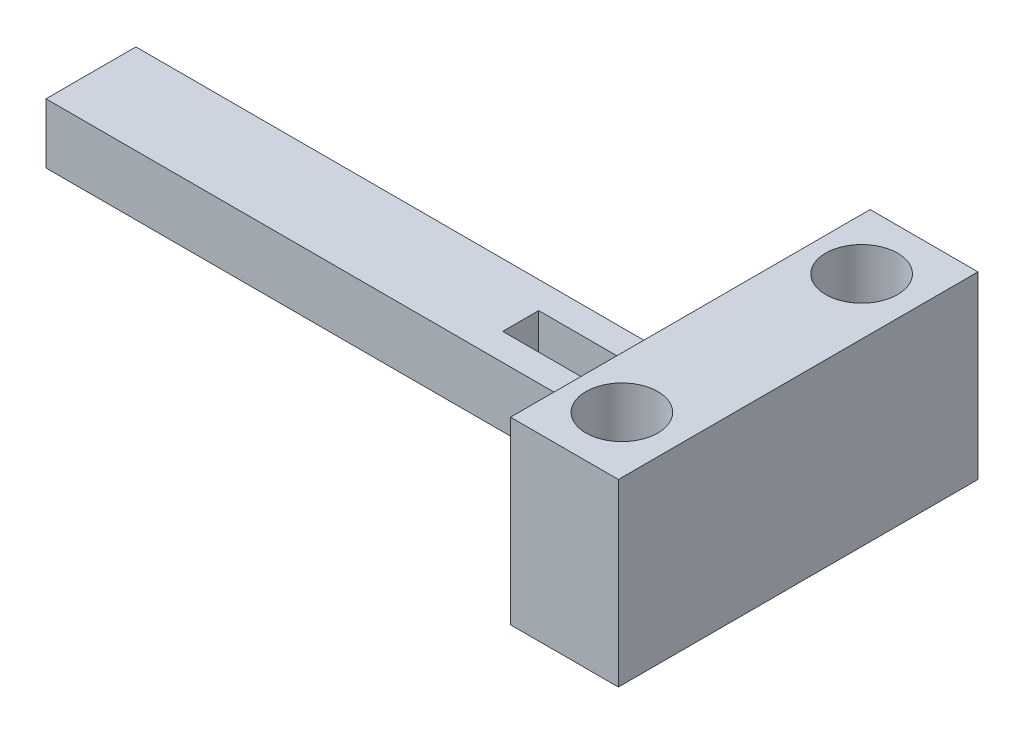
ISO-10303-21;
HEADER;
FILE_DESCRIPTION(('STEP AP214'),'2;1');
FILE_NAME('part.step','',(''),(''),'','','');
FILE_SCHEMA(('AUTOMOTIVE_DESIGN { 1 0 10303 214 1 1 1 1 }'));
ENDSEC;
DATA;
#1=APPLICATION_CONTEXT('core data for automotive mechanical design processes');
#2=APPLICATION_PROTOCOL_DEFINITION('international standard','automotive_design',2000,#1);
#3=PRODUCT_CONTEXT('',#1,'mechanical');
#4=PRODUCT('Part','Part','',(#3));
#5=PRODUCT_RELATED_PRODUCT_CATEGORY('part','',(#4));
#6=PRODUCT_DEFINITION_FORMATION('','',#4);
#7=PRODUCT_DEFINITION_CONTEXT('part definition',#1,'design');
#8=PRODUCT_DEFINITION('design','',#6,#7);
#9=PRODUCT_DEFINITION_SHAPE('','',#8);
#10=(LENGTH_UNIT() NAMED_UNIT(*) SI_UNIT(.MILLI.,.METRE.));
#11=(NAMED_UNIT(*) PLANE_ANGLE_UNIT() SI_UNIT($,.RADIAN.));
#12=(NAMED_UNIT(*) SI_UNIT($,.STERADIAN.) SOLID_ANGLE_UNIT());
#13=UNCERTAINTY_MEASURE_WITH_UNIT(LENGTH_MEASURE(1.E-05),#10,'distance_accuracy_value','');
#14=(GEOMETRIC_REPRESENTATION_CONTEXT(3) GLOBAL_UNCERTAINTY_ASSIGNED_CONTEXT((#13)) GLOBAL_UNIT_ASSIGNED_CONTEXT((#10,
#11,#12)) REPRESENTATION_CONTEXT('',''));
#15=CARTESIAN_POINT('',(0.,0.,0.));
#16=DIRECTION('',(0.,0.,1.));
#17=DIRECTION('',(1.,0.,0.));
#18=AXIS2_PLACEMENT_3D('',#15,#16,#17);
#19=CARTESIAN_POINT('',(0.,2.54,0.));
#20=DIRECTION('',(0.,1.,0.));
#21=DIRECTION('',(0.,0.,1.));
#22=AXIS2_PLACEMENT_3D('',#19,#20,#21);
#23=PLANE('',#22);
#24=DIRECTION('',(0.,0.,1.));
#25=VECTOR('',#24,1.);
#26=CARTESIAN_POINT('',(-12.7,2.54,1.905));
#27=LINE('',#26,#25);
#28=CARTESIAN_POINT('',(-12.7,2.54,-1.905));
#29=VERTEX_POINT('',#28);
#30=CARTESIAN_POINT('',(-12.7,2.54,1.905));
#31=VERTEX_POINT('',#30);
#32=EDGE_CURVE('E186',#29,#31,#27,.T.);
#33=ORIENTED_EDGE('',*,*,#32,.T.);
#34=DIRECTION('',(1.,0.,0.));
#35=VECTOR('',#34,1.);
#36=CARTESIAN_POINT('',(12.7,2.54,1.905));
#37=LINE('',#36,#35);
#38=CARTESIAN_POINT('',(12.7,2.54,1.905));
#39=VERTEX_POINT('',#38);
#40=EDGE_CURVE('E188',#31,#39,#37,.T.);
#41=ORIENTED_EDGE('',*,*,#40,.T.);
#42=DIRECTION('',(0.,0.,-1.));
#43=VECTOR('',#42,1.);
#44=CARTESIAN_POINT('',(12.7,2.54,1.905));
#45=LINE('',#44,#43);
#46=CARTESIAN_POINT('',(12.7,2.54,-1.905));
#47=VERTEX_POINT('',#46);
#48=EDGE_CURVE('E195',#39,#47,#45,.T.);
#49=ORIENTED_EDGE('',*,*,#48,.T.);
#50=DIRECTION('',(-1.,0.,0.));
#51=VECTOR('',#50,1.);
#52=CARTESIAN_POINT('',(12.7,2.54,-1.905));
#53=LINE('',#52,#51);
#54=EDGE_CURVE('E193',#47,#29,#53,.T.);
#55=ORIENTED_EDGE('',*,*,#54,.T.);
#56=EDGE_LOOP('',(#33,#41,#49,#55));
#57=FACE_BOUND('',#56,.T.);
#58=DIRECTION('',(-1.,0.,0.));
#59=VECTOR('',#58,1.);
#60=CARTESIAN_POINT('',(5.51234042553191,2.54,-0.762));
#61=LINE('',#60,#59);
#62=CARTESIAN_POINT('',(10.5923404255319,2.54,-0.762));
#63=VERTEX_POINT('',#62);
#64=CARTESIAN_POINT('',(5.51234042553191,2.54,-0.762));
#65=VERTEX_POINT('',#64);
#66=EDGE_CURVE('E163',#63,#65,#61,.T.);
#67=ORIENTED_EDGE('',*,*,#66,.F.);
#68=DIRECTION('',(0.,0.,-1.));
#69=VECTOR('',#68,1.);
#70=CARTESIAN_POINT('',(10.5923404255319,2.54,-0.762));
#71=LINE('',#70,#69);
#72=CARTESIAN_POINT('',(10.5923404255319,2.54,0.762));
#73=VERTEX_POINT('',#72);
#74=EDGE_CURVE('E165',#73,#63,#71,.T.);
#75=ORIENTED_EDGE('',*,*,#74,.F.);
#76=DIRECTION('',(1.,0.,0.));
#77=VECTOR('',#76,1.);
#78=CARTESIAN_POINT('',(5.51234042553191,2.54,0.762));
#79=LINE('',#78,#77);
#80=CARTESIAN_POINT('',(5.51234042553191,2.54,0.762));
#81=VERTEX_POINT('',#80);
#82=EDGE_CURVE('E166',#81,#73,#79,.T.);
#83=ORIENTED_EDGE('',*,*,#82,.F.);
#84=DIRECTION('',(0.,0.,1.));
#85=VECTOR('',#84,1.);
#86=CARTESIAN_POINT('',(5.51234042553191,2.54,-0.762));
#87=LINE('',#86,#85);
#88=EDGE_CURVE('E170',#65,#81,#87,.T.);
#89=ORIENTED_EDGE('',*,*,#88,.F.);
#90=EDGE_LOOP('',(#67,#75,#83,#89));
#91=FACE_BOUND('',#90,.T.);
#92=ADVANCED_FACE('F39',(#57,#91),#23,.T.);
#93=CARTESIAN_POINT('',(0.,0.,0.));
#94=DIRECTION('',(0.,1.,0.));
#95=DIRECTION('',(0.,0.,1.));
#96=AXIS2_PLACEMENT_3D('',#93,#94,#95);
#97=PLANE('',#96);
#98=DIRECTION('',(0.,0.,1.));
#99=VECTOR('',#98,1.);
#100=CARTESIAN_POINT('',(-12.7,0.,1.905));
#101=LINE('',#100,#99);
#102=CARTESIAN_POINT('',(-12.7,0.,-1.905));
#103=VERTEX_POINT('',#102);
#104=CARTESIAN_POINT('',(-12.7,0.,1.905));
#105=VERTEX_POINT('',#104);
#106=EDGE_CURVE('E183',#103,#105,#101,.T.);
#107=ORIENTED_EDGE('',*,*,#106,.F.);
#108=DIRECTION('',(-1.,0.,0.));
#109=VECTOR('',#108,1.);
#110=CARTESIAN_POINT('',(12.7,0.,-1.905));
#111=LINE('',#110,#109);
#112=CARTESIAN_POINT('',(12.7,0.,-1.905));
#113=VERTEX_POINT('',#112);
#114=EDGE_CURVE('E190',#113,#103,#111,.T.);
#115=ORIENTED_EDGE('',*,*,#114,.F.);
#116=DIRECTION('',(0.,0.,-1.));
#117=VECTOR('',#116,1.);
#118=CARTESIAN_POINT('',(12.7,0.,1.905));
#119=LINE('',#118,#117);
#120=CARTESIAN_POINT('',(12.7,0.,1.905));
#121=VERTEX_POINT('',#120);
#122=EDGE_CURVE('E205',#121,#113,#119,.T.);
#123=ORIENTED_EDGE('',*,*,#122,.F.);
#124=DIRECTION('',(1.,0.,0.));
#125=VECTOR('',#124,1.);
#126=CARTESIAN_POINT('',(12.7,0.,1.905));
#127=LINE('',#126,#125);
#128=EDGE_CURVE('E200',#105,#121,#127,.T.);
#129=ORIENTED_EDGE('',*,*,#128,.F.);
#130=EDGE_LOOP('',(#107,#115,#123,#129));
#131=FACE_BOUND('',#130,.T.);
#132=DIRECTION('',(0.,0.,-1.));
#133=VECTOR('',#132,1.);
#134=CARTESIAN_POINT('',(10.5923404255319,0.,-0.762));
#135=LINE('',#134,#133);
#136=CARTESIAN_POINT('',(10.5923404255319,0.,0.762));
#137=VERTEX_POINT('',#136);
#138=CARTESIAN_POINT('',(10.5923404255319,0.,-0.762));
#139=VERTEX_POINT('',#138);
#140=EDGE_CURVE('E62',#137,#139,#135,.T.);
#141=ORIENTED_EDGE('',*,*,#140,.T.);
#142=DIRECTION('',(-1.,0.,0.));
#143=VECTOR('',#142,1.);
#144=CARTESIAN_POINT('',(5.51234042553191,0.,-0.762));
#145=LINE('',#144,#143);
#146=CARTESIAN_POINT('',(5.51234042553191,0.,-0.762));
#147=VERTEX_POINT('',#146);
#148=EDGE_CURVE('E156',#139,#147,#145,.T.);
#149=ORIENTED_EDGE('',*,*,#148,.T.);
#150=DIRECTION('',(0.,0.,1.));
#151=VECTOR('',#150,1.);
#152=CARTESIAN_POINT('',(5.51234042553191,0.,-0.762));
#153=LINE('',#152,#151);
#154=CARTESIAN_POINT('',(5.51234042553191,0.,0.762));
#155=VERTEX_POINT('',#154);
#156=EDGE_CURVE('E173',#147,#155,#153,.T.);
#157=ORIENTED_EDGE('',*,*,#156,.T.);
#158=DIRECTION('',(1.,0.,0.));
#159=VECTOR('',#158,1.);
#160=CARTESIAN_POINT('',(5.51234042553191,0.,0.762));
#161=LINE('',#160,#159);
#162=EDGE_CURVE('E164',#155,#137,#161,.T.);
#163=ORIENTED_EDGE('',*,*,#162,.T.);
#164=EDGE_LOOP('',(#141,#149,#157,#163));
#165=FACE_BOUND('',#164,.T.);
#166=ADVANCED_FACE('F219',(#131,#165),#97,.F.);
#167=CARTESIAN_POINT('',(-12.7,2.54,1.905));
#168=DIRECTION('',(1.,0.,0.));
#169=DIRECTION('',(0.,0.,-1.));
#170=AXIS2_PLACEMENT_3D('',#167,#168,#169);
#171=PLANE('',#170);
#172=ORIENTED_EDGE('',*,*,#106,.T.);
#173=DIRECTION('',(0.,-1.,0.));
#174=VECTOR('',#173,1.);
#175=CARTESIAN_POINT('',(-12.7,2.54,1.905));
#176=LINE('',#175,#174);
#177=EDGE_CURVE('E11',#31,#105,#176,.T.);
#178=ORIENTED_EDGE('',*,*,#177,.F.);
#179=ORIENTED_EDGE('',*,*,#32,.F.);
#180=DIRECTION('',(0.,-1.,0.));
#181=VECTOR('',#180,1.);
#182=CARTESIAN_POINT('',(-12.7,2.54,-1.905));
#183=LINE('',#182,#181);
#184=EDGE_CURVE('E198',#29,#103,#183,.T.);
#185=ORIENTED_EDGE('',*,*,#184,.T.);
#186=EDGE_LOOP('',(#172,#178,#179,#185));
#187=FACE_BOUND('',#186,.T.);
#188=ADVANCED_FACE('F41',(#187),#171,.F.);
#189=CARTESIAN_POINT('',(12.7,2.54,1.905));
#190=DIRECTION('',(0.,0.,-1.));
#191=DIRECTION('',(-1.,0.,0.));
#192=AXIS2_PLACEMENT_3D('',#189,#190,#191);
#193=PLANE('',#192);
#194=ORIENTED_EDGE('',*,*,#128,.T.);
#195=DIRECTION('',(0.,-1.,0.));
#196=VECTOR('',#195,1.);
#197=CARTESIAN_POINT('',(12.7,2.54,1.905));
#198=LINE('',#197,#196);
#199=EDGE_CURVE('E50',#39,#121,#198,.T.);
#200=ORIENTED_EDGE('',*,*,#199,.F.);
#201=ORIENTED_EDGE('',*,*,#40,.F.);
#202=ORIENTED_EDGE('',*,*,#177,.T.);
#203=EDGE_LOOP('',(#194,#200,#201,#202));
#204=FACE_BOUND('',#203,.T.);
#205=ADVANCED_FACE('F216',(#204),#193,.F.);
#206=CARTESIAN_POINT('',(12.7,2.54,-1.905));
#207=DIRECTION('',(0.,0.,1.));
#208=DIRECTION('',(1.,0.,0.));
#209=AXIS2_PLACEMENT_3D('',#206,#207,#208);
#210=PLANE('',#209);
#211=ORIENTED_EDGE('',*,*,#114,.T.);
#212=ORIENTED_EDGE('',*,*,#184,.F.);
#213=ORIENTED_EDGE('',*,*,#54,.F.);
#214=DIRECTION('',(0.,-1.,0.));
#215=VECTOR('',#214,1.);
#216=CARTESIAN_POINT('',(12.7,2.54,-1.905));
#217=LINE('',#216,#215);
#218=EDGE_CURVE('E208',#47,#113,#217,.T.);
#219=ORIENTED_EDGE('',*,*,#218,.T.);
#220=EDGE_LOOP('',(#211,#212,#213,#219));
#221=FACE_BOUND('',#220,.T.);
#222=ADVANCED_FACE('F223',(#221),#210,.F.);
#223=CARTESIAN_POINT('',(10.5923404255319,2.54,-0.762));
#224=DIRECTION('',(-1.,0.,0.));
#225=DIRECTION('',(0.,0.,1.));
#226=AXIS2_PLACEMENT_3D('',#223,#224,#225);
#227=PLANE('',#226);
#228=ORIENTED_EDGE('',*,*,#140,.F.);
#229=DIRECTION('',(0.,-1.,0.));
#230=VECTOR('',#229,1.);
#231=CARTESIAN_POINT('',(10.5923404255319,2.54,0.762));
#232=LINE('',#231,#230);
#233=EDGE_CURVE('E168',#73,#137,#232,.T.);
#234=ORIENTED_EDGE('',*,*,#233,.F.);
#235=ORIENTED_EDGE('',*,*,#74,.T.);
#236=DIRECTION('',(0.,-1.,0.));
#237=VECTOR('',#236,1.);
#238=CARTESIAN_POINT('',(10.5923404255319,2.54,-0.762));
#239=LINE('',#238,#237);
#240=EDGE_CURVE('E181',#63,#139,#239,.T.);
#241=ORIENTED_EDGE('',*,*,#240,.T.);
#242=EDGE_LOOP('',(#228,#234,#235,#241));
#243=FACE_BOUND('',#242,.T.);
#244=ADVANCED_FACE('F243',(#243),#227,.T.);
#245=CARTESIAN_POINT('',(5.51234042553191,2.54,-0.762));
#246=DIRECTION('',(0.,0.,1.));
#247=DIRECTION('',(1.,0.,0.));
#248=AXIS2_PLACEMENT_3D('',#245,#246,#247);
#249=PLANE('',#248);
#250=ORIENTED_EDGE('',*,*,#148,.F.);
#251=ORIENTED_EDGE('',*,*,#240,.F.);
#252=ORIENTED_EDGE('',*,*,#66,.T.);
#253=DIRECTION('',(0.,-1.,0.));
#254=VECTOR('',#253,1.);
#255=CARTESIAN_POINT('',(5.51234042553191,2.54,-0.762));
#256=LINE('',#255,#254);
#257=EDGE_CURVE('E182',#65,#147,#256,.T.);
#258=ORIENTED_EDGE('',*,*,#257,.T.);
#259=EDGE_LOOP('',(#250,#251,#252,#258));
#260=FACE_BOUND('',#259,.T.);
#261=ADVANCED_FACE('F238',(#260),#249,.T.);
#262=CARTESIAN_POINT('',(5.51234042553191,2.54,-0.762));
#263=DIRECTION('',(1.,0.,0.));
#264=DIRECTION('',(0.,0.,-1.));
#265=AXIS2_PLACEMENT_3D('',#262,#263,#264);
#266=PLANE('',#265);
#267=ORIENTED_EDGE('',*,*,#156,.F.);
#268=ORIENTED_EDGE('',*,*,#257,.F.);
#269=ORIENTED_EDGE('',*,*,#88,.T.);
#270=DIRECTION('',(0.,-1.,0.));
#271=VECTOR('',#270,1.);
#272=CARTESIAN_POINT('',(5.51234042553191,2.54,0.762));
#273=LINE('',#272,#271);
#274=EDGE_CURVE('E53',#81,#155,#273,.T.);
#275=ORIENTED_EDGE('',*,*,#274,.T.);
#276=EDGE_LOOP('',(#267,#268,#269,#275));
#277=FACE_BOUND('',#276,.T.);
#278=ADVANCED_FACE('F244',(#277),#266,.T.);
#279=CARTESIAN_POINT('',(5.51234042553191,2.54,0.762));
#280=DIRECTION('',(0.,0.,-1.));
#281=DIRECTION('',(-1.,0.,0.));
#282=AXIS2_PLACEMENT_3D('',#279,#280,#281);
#283=PLANE('',#282);
#284=ORIENTED_EDGE('',*,*,#162,.F.);
#285=ORIENTED_EDGE('',*,*,#274,.F.);
#286=ORIENTED_EDGE('',*,*,#82,.T.);
#287=ORIENTED_EDGE('',*,*,#233,.T.);
#288=EDGE_LOOP('',(#284,#285,#286,#287));
#289=FACE_BOUND('',#288,.T.);
#290=ADVANCED_FACE('F245',(#289),#283,.T.);
#291=CARTESIAN_POINT('',(12.7,0.,0.));
#292=DIRECTION('',(1.,0.,0.));
#293=DIRECTION('',(0.,0.,-1.));
#294=AXIS2_PLACEMENT_3D('',#291,#292,#293);
#295=PLANE('',#294);
#296=DIRECTION('',(0.,1.,0.));
#297=VECTOR('',#296,1.);
#298=CARTESIAN_POINT('',(12.7,6.41290814723503,-7.62));
#299=LINE('',#298,#297);
#300=CARTESIAN_POINT('',(12.7,-1.20709185276496,-7.62));
#301=VERTEX_POINT('',#300);
#302=CARTESIAN_POINT('',(12.7,6.41290814723503,-7.62));
#303=VERTEX_POINT('',#302);
#304=EDGE_CURVE('E152',#301,#303,#299,.T.);
#305=ORIENTED_EDGE('',*,*,#304,.F.);
#306=DIRECTION('',(0.,0.,-1.));
#307=VECTOR('',#306,1.);
#308=CARTESIAN_POINT('',(12.7,-1.20709185276497,7.62));
#309=LINE('',#308,#307);
#310=CARTESIAN_POINT('',(12.7,-1.20709185276497,7.62));
#311=VERTEX_POINT('',#310);
#312=EDGE_CURVE('E147',#311,#301,#309,.T.);
#313=ORIENTED_EDGE('',*,*,#312,.F.);
#314=DIRECTION('',(0.,-1.,0.));
#315=VECTOR('',#314,1.);
#316=CARTESIAN_POINT('',(12.7,6.41290814723503,7.62));
#317=LINE('',#316,#315);
#318=CARTESIAN_POINT('',(12.7,6.41290814723503,7.62));
#319=VERTEX_POINT('',#318);
#320=EDGE_CURVE('E390',#319,#311,#317,.T.);
#321=ORIENTED_EDGE('',*,*,#320,.F.);
#322=DIRECTION('',(0.,0.,1.));
#323=VECTOR('',#322,1.);
#324=CARTESIAN_POINT('',(12.7,6.41290814723503,7.62));
#325=LINE('',#324,#323);
#326=EDGE_CURVE('E384',#303,#319,#325,.T.);
#327=ORIENTED_EDGE('',*,*,#326,.F.);
#328=EDGE_LOOP('',(#305,#313,#321,#327));
#329=FACE_BOUND('',#328,.T.);
#330=ORIENTED_EDGE('',*,*,#199,.T.);
#331=ORIENTED_EDGE('',*,*,#122,.T.);
#332=ORIENTED_EDGE('',*,*,#218,.F.);
#333=ORIENTED_EDGE('',*,*,#48,.F.);
#334=EDGE_LOOP('',(#330,#331,#332,#333));
#335=FACE_BOUND('',#334,.T.);
#336=ADVANCED_FACE('F213',(#329,#335),#295,.F.);
#337=CARTESIAN_POINT('',(17.272,6.41290814723503,-7.62));
#338=DIRECTION('',(0.,0.,1.));
#339=DIRECTION('',(0.,-1.,0.));
#340=AXIS2_PLACEMENT_3D('',#337,#338,#339);
#341=PLANE('',#340);
#342=ORIENTED_EDGE('',*,*,#304,.T.);
#343=DIRECTION('',(-1.,0.,0.));
#344=VECTOR('',#343,1.);
#345=CARTESIAN_POINT('',(17.272,6.41290814723503,-7.62));
#346=LINE('',#345,#344);
#347=CARTESIAN_POINT('',(17.272,6.41290814723503,-7.62));
#348=VERTEX_POINT('',#347);
#349=EDGE_CURVE('E133',#348,#303,#346,.T.);
#350=ORIENTED_EDGE('',*,*,#349,.F.);
#351=DIRECTION('',(0.,1.,0.));
#352=VECTOR('',#351,1.);
#353=CARTESIAN_POINT('',(17.272,6.41290814723503,-7.62));
#354=LINE('',#353,#352);
#355=CARTESIAN_POINT('',(17.272,-1.20709185276496,-7.62));
#356=VERTEX_POINT('',#355);
#357=EDGE_CURVE('E143',#356,#348,#354,.T.);
#358=ORIENTED_EDGE('',*,*,#357,.F.);
#359=DIRECTION('',(-1.,0.,0.));
#360=VECTOR('',#359,1.);
#361=CARTESIAN_POINT('',(17.272,-1.20709185276496,-7.62));
#362=LINE('',#361,#360);
#363=EDGE_CURVE('E382',#356,#301,#362,.T.);
#364=ORIENTED_EDGE('',*,*,#363,.T.);
#365=EDGE_LOOP('',(#342,#350,#358,#364));
#366=FACE_BOUND('',#365,.T.);
#367=ADVANCED_FACE('F155',(#366),#341,.F.);
#368=CARTESIAN_POINT('',(17.272,6.41290814723503,7.62));
#369=DIRECTION('',(0.,-1.,0.));
#370=DIRECTION('',(0.,0.,-1.));
#371=AXIS2_PLACEMENT_3D('',#368,#369,#370);
#372=PLANE('',#371);
#373=CARTESIAN_POINT('',(14.8797772271454,6.41290814723503,5.08));
#374=DIRECTION('',(0.,1.,0.));
#375=DIRECTION('',(0.,0.,1.));
#376=AXIS2_PLACEMENT_3D('',#373,#374,#375);
#377=CIRCLE('',#376,1.524);
#378=CARTESIAN_POINT('',(14.8797772271454,6.41290814723503,6.604));
#379=VERTEX_POINT('',#378);
#380=EDGE_CURVE('E371',#379,#379,#377,.T.);
#381=ORIENTED_EDGE('',*,*,#380,.F.);
#382=EDGE_LOOP('',(#381));
#383=FACE_BOUND('',#382,.T.);
#384=CARTESIAN_POINT('',(14.8797772271454,6.41290814723504,-5.08));
#385=DIRECTION('',(0.,1.,0.));
#386=DIRECTION('',(0.,0.,-1.));
#387=AXIS2_PLACEMENT_3D('',#384,#385,#386);
#388=CIRCLE('',#387,1.524);
#389=CARTESIAN_POINT('',(14.8797772271454,6.41290814723504,-6.604));
#390=VERTEX_POINT('',#389);
#391=EDGE_CURVE('E375',#390,#390,#388,.T.);
#392=ORIENTED_EDGE('',*,*,#391,.F.);
#393=EDGE_LOOP('',(#392));
#394=FACE_BOUND('',#393,.T.);
#395=ORIENTED_EDGE('',*,*,#326,.T.);
#396=DIRECTION('',(-1.,0.,0.));
#397=VECTOR('',#396,1.);
#398=CARTESIAN_POINT('',(17.272,6.41290814723503,7.62));
#399=LINE('',#398,#397);
#400=CARTESIAN_POINT('',(17.272,6.41290814723503,7.62));
#401=VERTEX_POINT('',#400);
#402=EDGE_CURVE('E140',#401,#319,#399,.T.);
#403=ORIENTED_EDGE('',*,*,#402,.F.);
#404=DIRECTION('',(0.,0.,1.));
#405=VECTOR('',#404,1.);
#406=CARTESIAN_POINT('',(17.272,6.41290814723503,7.62));
#407=LINE('',#406,#405);
#408=EDGE_CURVE('E128',#348,#401,#407,.T.);
#409=ORIENTED_EDGE('',*,*,#408,.F.);
#410=ORIENTED_EDGE('',*,*,#349,.T.);
#411=EDGE_LOOP('',(#395,#403,#409,#410));
#412=FACE_BOUND('',#411,.T.);
#413=ADVANCED_FACE('F132',(#383,#394,#412),#372,.F.);
#414=CARTESIAN_POINT('',(17.272,6.41290814723503,7.62));
#415=DIRECTION('',(0.,0.,-1.));
#416=DIRECTION('',(-1.,0.,0.));
#417=AXIS2_PLACEMENT_3D('',#414,#415,#416);
#418=PLANE('',#417);
#419=ORIENTED_EDGE('',*,*,#320,.T.);
#420=DIRECTION('',(-1.,0.,0.));
#421=VECTOR('',#420,1.);
#422=CARTESIAN_POINT('',(17.272,-1.20709185276497,7.62));
#423=LINE('',#422,#421);
#424=CARTESIAN_POINT('',(17.272,-1.20709185276497,7.62));
#425=VERTEX_POINT('',#424);
#426=EDGE_CURVE('E158',#425,#311,#423,.T.);
#427=ORIENTED_EDGE('',*,*,#426,.F.);
#428=DIRECTION('',(0.,-1.,0.));
#429=VECTOR('',#428,1.);
#430=CARTESIAN_POINT('',(17.272,6.41290814723503,7.62));
#431=LINE('',#430,#429);
#432=EDGE_CURVE('E139',#401,#425,#431,.T.);
#433=ORIENTED_EDGE('',*,*,#432,.F.);
#434=ORIENTED_EDGE('',*,*,#402,.T.);
#435=EDGE_LOOP('',(#419,#427,#433,#434));
#436=FACE_BOUND('',#435,.T.);
#437=ADVANCED_FACE('F316',(#436),#418,.F.);
#438=CARTESIAN_POINT('',(17.272,-1.20709185276497,7.62));
#439=DIRECTION('',(0.,1.,0.));
#440=DIRECTION('',(0.,0.,1.));
#441=AXIS2_PLACEMENT_3D('',#438,#439,#440);
#442=PLANE('',#441);
#443=CARTESIAN_POINT('',(14.8797772271454,-1.20709185276497,5.08));
#444=DIRECTION('',(0.,1.,0.));
#445=DIRECTION('',(0.,0.,1.));
#446=AXIS2_PLACEMENT_3D('',#443,#444,#445);
#447=CIRCLE('',#446,1.524);
#448=CARTESIAN_POINT('',(14.8797772271454,-1.20709185276497,6.604));
#449=VERTEX_POINT('',#448);
#450=EDGE_CURVE('E366',#449,#449,#447,.T.);
#451=ORIENTED_EDGE('',*,*,#450,.T.);
#452=EDGE_LOOP('',(#451));
#453=FACE_BOUND('',#452,.T.);
#454=CARTESIAN_POINT('',(14.8797772271454,-1.20709185276497,-5.08));
#455=DIRECTION('',(0.,1.,0.));
#456=DIRECTION('',(0.,0.,-1.));
#457=AXIS2_PLACEMENT_3D('',#454,#455,#456);
#458=CIRCLE('',#457,1.524);
#459=CARTESIAN_POINT('',(14.8797772271454,-1.20709185276497,-6.60400000000001));
#460=VERTEX_POINT('',#459);
#461=EDGE_CURVE('E376',#460,#460,#458,.T.);
#462=ORIENTED_EDGE('',*,*,#461,.T.);
#463=EDGE_LOOP('',(#462));
#464=FACE_BOUND('',#463,.T.);
#465=ORIENTED_EDGE('',*,*,#312,.T.);
#466=ORIENTED_EDGE('',*,*,#363,.F.);
#467=DIRECTION('',(0.,0.,-1.));
#468=VECTOR('',#467,1.);
#469=CARTESIAN_POINT('',(17.272,-1.20709185276497,7.62));
#470=LINE('',#469,#468);
#471=EDGE_CURVE('E148',#425,#356,#470,.T.);
#472=ORIENTED_EDGE('',*,*,#471,.F.);
#473=ORIENTED_EDGE('',*,*,#426,.T.);
#474=EDGE_LOOP('',(#465,#466,#472,#473));
#475=FACE_BOUND('',#474,.T.);
#476=ADVANCED_FACE('F326',(#453,#464,#475),#442,.F.);
#477=CARTESIAN_POINT('',(17.272,0.,0.));
#478=DIRECTION('',(1.,0.,0.));
#479=DIRECTION('',(0.,0.,-1.));
#480=AXIS2_PLACEMENT_3D('',#477,#478,#479);
#481=PLANE('',#480);
#482=ORIENTED_EDGE('',*,*,#357,.T.);
#483=ORIENTED_EDGE('',*,*,#408,.T.);
#484=ORIENTED_EDGE('',*,*,#432,.T.);
#485=ORIENTED_EDGE('',*,*,#471,.T.);
#486=EDGE_LOOP('',(#482,#483,#484,#485));
#487=FACE_BOUND('',#486,.T.);
#488=ADVANCED_FACE('F145',(#487),#481,.T.);
#489=CARTESIAN_POINT('',(14.8797772271454,-1.20709185276497,-5.08));
#490=DIRECTION('',(0.,1.,0.));
#491=DIRECTION('',(0.,0.,1.));
#492=AXIS2_PLACEMENT_3D('',#489,#490,#491);
#493=CYLINDRICAL_SURFACE('',#492,1.524);
#494=ORIENTED_EDGE('',*,*,#461,.F.);
#495=EDGE_LOOP('',(#494));
#496=FACE_BOUND('',#495,.T.);
#497=ORIENTED_EDGE('',*,*,#391,.T.);
#498=EDGE_LOOP('',(#497));
#499=FACE_BOUND('',#498,.T.);
#500=ADVANCED_FACE('F343',(#496,#499),#493,.F.);
#501=CARTESIAN_POINT('',(14.8797772271454,-1.20709185276497,5.08));
#502=DIRECTION('',(0.,1.,0.));
#503=DIRECTION('',(0.,0.,1.));
#504=AXIS2_PLACEMENT_3D('',#501,#502,#503);
#505=CYLINDRICAL_SURFACE('',#504,1.524);
#506=ORIENTED_EDGE('',*,*,#450,.F.);
#507=EDGE_LOOP('',(#506));
#508=FACE_BOUND('',#507,.T.);
#509=ORIENTED_EDGE('',*,*,#380,.T.);
#510=EDGE_LOOP('',(#509));
#511=FACE_BOUND('',#510,.T.);
#512=ADVANCED_FACE('F352',(#508,#511),#505,.F.);
#513=CLOSED_SHELL('',(#92,#166,#188,#205,#222,#244,#261,#278,#290,#336,#367,#413,#437,#476,#488,
#500,#512));
#514=MANIFOLD_SOLID_BREP('B2',#513);
#515=ADVANCED_BREP_SHAPE_REPRESENTATION('',(#18,#514),#14);
#516=SHAPE_DEFINITION_REPRESENTATION(#9,#515);
ENDSEC;
END-ISO-10303-21;
